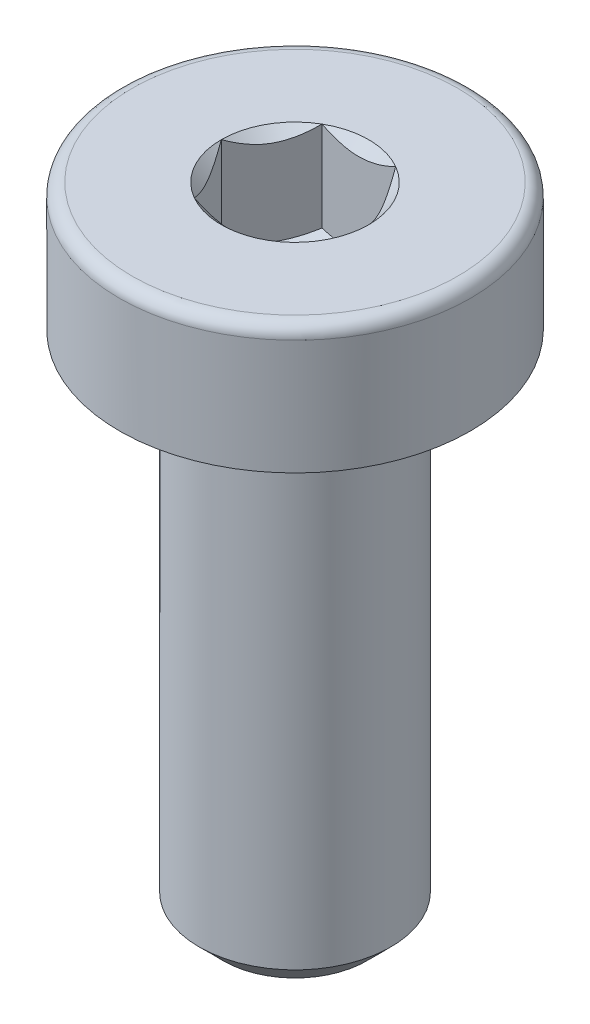
ISO-10303-21;
HEADER;
FILE_DESCRIPTION(('STEP AP214'),'2;1');
FILE_NAME('part.step','',(''),(''),'','','');
FILE_SCHEMA(('AUTOMOTIVE_DESIGN { 1 0 10303 214 1 1 1 1 }'));
ENDSEC;
DATA;
#1=APPLICATION_CONTEXT('core data for automotive mechanical design processes');
#2=APPLICATION_PROTOCOL_DEFINITION('international standard','automotive_design',2000,#1);
#3=PRODUCT_CONTEXT('',#1,'mechanical');
#4=PRODUCT('Part','Part','',(#3));
#5=PRODUCT_RELATED_PRODUCT_CATEGORY('part','',(#4));
#6=PRODUCT_DEFINITION_FORMATION('','',#4);
#7=PRODUCT_DEFINITION_CONTEXT('part definition',#1,'design');
#8=PRODUCT_DEFINITION('design','',#6,#7);
#9=PRODUCT_DEFINITION_SHAPE('','',#8);
#10=(LENGTH_UNIT() NAMED_UNIT(*) SI_UNIT(.MILLI.,.METRE.));
#11=(NAMED_UNIT(*) PLANE_ANGLE_UNIT() SI_UNIT($,.RADIAN.));
#12=(NAMED_UNIT(*) SI_UNIT($,.STERADIAN.) SOLID_ANGLE_UNIT());
#13=UNCERTAINTY_MEASURE_WITH_UNIT(LENGTH_MEASURE(1.E-05),#10,'distance_accuracy_value','');
#14=(GEOMETRIC_REPRESENTATION_CONTEXT(3) GLOBAL_UNCERTAINTY_ASSIGNED_CONTEXT((#13)) GLOBAL_UNIT_ASSIGNED_CONTEXT((#10,
#11,#12)) REPRESENTATION_CONTEXT('',''));
#15=CARTESIAN_POINT('',(0.,0.,0.));
#16=DIRECTION('',(0.,0.,1.));
#17=DIRECTION('',(1.,0.,0.));
#18=AXIS2_PLACEMENT_3D('',#15,#16,#17);
#19=CARTESIAN_POINT('',(0.,-0.2,0.));
#20=DIRECTION('',(0.,1.,0.));
#21=DIRECTION('',(0.,0.,1.));
#22=AXIS2_PLACEMENT_3D('',#19,#20,#21);
#23=TOROIDAL_SURFACE('',#22,1.7,0.2);
#24=CARTESIAN_POINT('',(0.,0.,0.));
#25=DIRECTION('',(0.,1.,0.));
#26=DIRECTION('',(0.,0.,1.));
#27=AXIS2_PLACEMENT_3D('',#24,#25,#26);
#28=CIRCLE('',#27,1.7);
#29=CARTESIAN_POINT('',(0.,0.,1.7));
#30=VERTEX_POINT('',#29);
#31=EDGE_CURVE('E128',#30,#30,#28,.T.);
#32=ORIENTED_EDGE('',*,*,#31,.F.);
#33=EDGE_LOOP('',(#32));
#34=FACE_BOUND('',#33,.T.);
#35=CARTESIAN_POINT('',(0.,-0.2,0.));
#36=DIRECTION('',(0.,-1.,0.));
#37=DIRECTION('',(0.,0.,1.));
#38=AXIS2_PLACEMENT_3D('',#35,#36,#37);
#39=CIRCLE('',#38,1.5);
#40=CARTESIAN_POINT('',(0.,-0.2,1.5));
#41=VERTEX_POINT('',#40);
#42=EDGE_CURVE('E145',#41,#41,#39,.T.);
#43=ORIENTED_EDGE('',*,*,#42,.F.);
#44=EDGE_LOOP('',(#43));
#45=FACE_BOUND('',#44,.T.);
#46=ADVANCED_FACE('F16',(#34,#45),#23,.F.);
#47=CARTESIAN_POINT('',(0.,-8.,0.));
#48=DIRECTION('',(0.,1.,0.));
#49=DIRECTION('',(1.,0.,0.));
#50=AXIS2_PLACEMENT_3D('',#47,#48,#49);
#51=PLANE('',#50);
#52=CARTESIAN_POINT('',(0.,-8.,0.));
#53=DIRECTION('',(0.,-1.,0.));
#54=DIRECTION('',(0.,0.,1.));
#55=AXIS2_PLACEMENT_3D('',#52,#53,#54);
#56=CIRCLE('',#55,1.125);
#57=CARTESIAN_POINT('',(0.,-8.,1.125));
#58=VERTEX_POINT('',#57);
#59=EDGE_CURVE('E11',#58,#58,#56,.T.);
#60=ORIENTED_EDGE('',*,*,#59,.T.);
#61=EDGE_LOOP('',(#60));
#62=FACE_BOUND('',#61,.T.);
#63=ADVANCED_FACE('F213',(#62),#51,.F.);
#64=CARTESIAN_POINT('',(0.,-8.125,0.));
#65=DIRECTION('',(0.,1.,0.));
#66=DIRECTION('',(-1.,0.,0.));
#67=AXIS2_PLACEMENT_3D('',#64,#65,#66);
#68=CONICAL_SURFACE('',#67,1.,0.785398163397448);
#69=ORIENTED_EDGE('',*,*,#59,.F.);
#70=EDGE_LOOP('',(#69));
#71=FACE_BOUND('',#70,.T.);
#72=CARTESIAN_POINT('',(0.,-7.625,0.));
#73=DIRECTION('',(0.,-1.,0.));
#74=DIRECTION('',(-1.,0.,0.));
#75=AXIS2_PLACEMENT_3D('',#72,#73,#74);
#76=CIRCLE('',#75,1.5);
#77=CARTESIAN_POINT('',(-1.5,-7.625,0.));
#78=VERTEX_POINT('',#77);
#79=EDGE_CURVE('E149',#78,#78,#76,.T.);
#80=ORIENTED_EDGE('',*,*,#79,.T.);
#81=EDGE_LOOP('',(#80));
#82=FACE_BOUND('',#81,.T.);
#83=ADVANCED_FACE('F170',(#71,#82),#68,.T.);
#84=CARTESIAN_POINT('',(-1.15470053837925,0.5,0.));
#85=DIRECTION('',(-0.866025403784439,0.,0.5));
#86=DIRECTION('',(0.,1.,0.));
#87=AXIS2_PLACEMENT_3D('',#84,#85,#86);
#88=PLANE('',#87);
#89=CARTESIAN_POINT('',(-1.15470053837925,2.,0.));
#90=CARTESIAN_POINT('',(-1.00117078125086,1.84647024287162,0.265921339820074));
#91=CARTESIAN_POINT('',(-0.867089249093141,1.84530172515184,0.498157365873931));
#92=CARTESIAN_POINT('',(-0.733215253083504,1.8441350161052,0.730033928774895));
#93=CARTESIAN_POINT('',(-0.57735026918948,1.99999999999927,1.00000000000025));
#94=B_SPLINE_CURVE_WITH_KNOTS('',2,(#89,#90,#91,#92,#93),.UNSPECIFIED.,.F.,.F.,(3,2,3),(0.,0.5,
1.),.UNSPECIFIED.);
#95=CARTESIAN_POINT('',(-1.15470053837925,2.,0.));
#96=VERTEX_POINT('',#95);
#97=CARTESIAN_POINT('',(-0.577350269189626,2.,1.));
#98=VERTEX_POINT('',#97);
#99=EDGE_CURVE('E135',#96,#98,#94,.T.);
#100=ORIENTED_EDGE('',*,*,#99,.T.);
#101=DIRECTION('',(0.,1.,0.));
#102=VECTOR('',#101,1.);
#103=CARTESIAN_POINT('',(-0.577350269189626,0.5,1.));
#104=LINE('',#103,#102);
#105=CARTESIAN_POINT('',(-0.577350269189626,0.589316397477042,1.));
#106=VERTEX_POINT('',#105);
#107=EDGE_CURVE('E334',#106,#98,#104,.T.);
#108=ORIENTED_EDGE('',*,*,#107,.F.);
#109=CARTESIAN_POINT('',(-1.15470053837925,0.589316397477043,0.));
#110=CARTESIAN_POINT('',(-1.1422776254852,0.582145061548454,0.021515887063845));
#111=CARTESIAN_POINT('',(-1.12980572440145,0.575290529962869,0.0431130815008311));
#112=CARTESIAN_POINT('',(-1.10516877386456,0.562518070323557,0.0858404042081745));
#113=CARTESIAN_POINT('',(-1.09300571707735,0.556578244850613,0.106965156736799));
#114=CARTESIAN_POINT('',(-1.06894241920652,0.545632531934319,0.148883907199831));
#115=CARTESIAN_POINT('',(-1.05704304561731,0.540607317583832,0.169673316642415));
#116=CARTESIAN_POINT('',(-1.03344126715609,0.531488117613305,0.211063578718422));
#117=CARTESIAN_POINT('',(-1.02173909837023,0.527379242171332,0.231661269176965));
#118=CARTESIAN_POINT('',(-0.998439619296902,0.520087570224119,0.272815704232481));
#119=CARTESIAN_POINT('',(-0.986842367431211,0.516896357949622,0.293370983478975));
#120=CARTESIAN_POINT('',(-0.963630649649038,0.511432897740972,0.33458880079611));
#121=CARTESIAN_POINT('',(-0.952016187375457,0.509160477291832,0.355251317992815));
#122=CARTESIAN_POINT('',(-0.928615137972573,0.505525933544308,0.396828053797181));
#123=CARTESIAN_POINT('',(-0.916827980653532,0.504172969622274,0.41774275139525));
#124=CARTESIAN_POINT('',(-0.892891053471395,0.502367479696766,0.459958305071784));
#125=CARTESIAN_POINT('',(-0.88073874884194,0.501933526563364,0.481258507610898));
#126=CARTESIAN_POINT('',(-0.856257235695783,0.501957698326459,0.523654214585648));
#127=CARTESIAN_POINT('',(-0.843928822248721,0.502412614939665,0.544750180023796));
#128=CARTESIAN_POINT('',(-0.819420681665752,0.504253995001974,0.586439287846091));
#129=CARTESIAN_POINT('',(-0.80724270276635,0.505622235893781,0.607034252182705));
#130=CARTESIAN_POINT('',(-0.783017066755103,0.509280885955065,0.647952632793485));
#131=CARTESIAN_POINT('',(-0.770969274303699,0.511562376898162,0.668276765739735));
#132=CARTESIAN_POINT('',(-0.746956492541301,0.51703779791969,0.708859066345339));
#133=CARTESIAN_POINT('',(-0.734991529583474,0.520232005852064,0.729117212014218));
#134=CARTESIAN_POINT('',(-0.711075209617807,0.527523596594688,0.769746807127452));
#135=CARTESIAN_POINT('',(-0.699125090769733,0.531629372272877,0.790117471798635));
#136=CARTESIAN_POINT('',(-0.675154824355723,0.540736433878131,0.831125976310756));
#137=CARTESIAN_POINT('',(-0.663137276162293,0.545752483880906,0.851762040669467));
#138=CARTESIAN_POINT('',(-0.638941132936142,0.556674024791821,0.893430606128303));
#139=CARTESIAN_POINT('',(-0.626766044340648,0.562598648059455,0.914460089337463));
#140=CARTESIAN_POINT('',(-0.602159683115032,0.575334898103387,0.957023431622116));
#141=CARTESIAN_POINT('',(-0.58973203881774,0.582168191432241,0.978552925679333));
#142=CARTESIAN_POINT('',(-0.57735026918962,0.589316397477036,0.999999999999998));
#143=B_SPLINE_CURVE_WITH_KNOTS('',3,(#109,#110,#111,#112,#113,#114,#115,#116,#117,#118,#119,
#120,#121,#122,#123,#124,#125,#126,#127,#128,#129,#130,#131,#132,#133,#134,#135,#136,#137,#138,
#139,#140,#141,#142),.UNSPECIFIED.,.F.,.F.,(4,2,2,2,2,2,2,2,2,2,2,2,2,2,2,2,4),(0.,
0.0775799336285172,0.15283713344211,0.226249266739255,0.298363815314992,0.369794224205565,
0.441211214882481,0.51332960442225,0.586892093802747,0.66018955743096,0.732066645944519,
0.803258313913417,0.8744716775434,0.946370107950428,1.01956032219192,1.09458388807375,
1.17191346643988),.UNSPECIFIED.);
#144=CARTESIAN_POINT('',(-1.15470053837925,0.589316397477044,0.));
#145=VERTEX_POINT('',#144);
#146=EDGE_CURVE('E250',#145,#106,#143,.T.);
#147=ORIENTED_EDGE('',*,*,#146,.F.);
#148=DIRECTION('',(0.,1.,0.));
#149=VECTOR('',#148,1.);
#150=CARTESIAN_POINT('',(-1.15470053837925,0.5,0.));
#151=LINE('',#150,#149);
#152=EDGE_CURVE('E29',#145,#96,#151,.T.);
#153=ORIENTED_EDGE('',*,*,#152,.T.);
#154=EDGE_LOOP('',(#100,#108,#147,#153));
#155=FACE_BOUND('',#154,.T.);
#156=ADVANCED_FACE('F160',(#155),#88,.F.);
#157=CARTESIAN_POINT('',(-0.577350269189624,0.5,-1.));
#158=DIRECTION('',(-0.866025403784438,0.,-0.5));
#159=DIRECTION('',(-0.5,0.,0.866025403784438));
#160=AXIS2_PLACEMENT_3D('',#157,#158,#159);
#161=PLANE('',#160);
#162=CARTESIAN_POINT('',(-0.577350269189625,2.,-0.999999999999998));
#163=CARTESIAN_POINT('',(-0.730880026318,1.84647024287162,-0.734078660179944));
#164=CARTESIAN_POINT('',(-0.864961558475733,1.84530172515184,-0.501842634126069));
#165=CARTESIAN_POINT('',(-0.998835554485382,1.8441350161052,-0.269966071225084));
#166=CARTESIAN_POINT('',(-1.15470053837939,1.99999999999928,2.43945488809238E-13));
#167=B_SPLINE_CURVE_WITH_KNOTS('',2,(#162,#163,#164,#165,#166),.UNSPECIFIED.,.F.,.F.,(3,2,3),
(0.,0.5,1.),.UNSPECIFIED.);
#168=CARTESIAN_POINT('',(-0.577350269189625,2.,-1.));
#169=VERTEX_POINT('',#168);
#170=EDGE_CURVE('E402',#169,#96,#167,.T.);
#171=ORIENTED_EDGE('',*,*,#170,.T.);
#172=ORIENTED_EDGE('',*,*,#152,.F.);
#173=CARTESIAN_POINT('',(-0.577350269189627,0.589316397477045,-1.));
#174=CARTESIAN_POINT('',(-0.589772117524805,0.582145061548479,-0.978483498312897));
#175=CARTESIAN_POINT('',(-0.602239886015797,0.575290529962917,-0.956883917922458));
#176=CARTESIAN_POINT('',(-0.626924357647565,0.562518070323645,-0.914184031532187));
#177=CARTESIAN_POINT('',(-0.639137401592391,0.556578244850719,-0.893088139102523));
#178=CARTESIAN_POINT('',(-0.663408455452852,0.54563253193445,-0.851289336616123));
#179=CARTESIAN_POINT('',(-0.675462925365203,0.540607317583974,-0.830589472077488));
#180=CARTESIAN_POINT('',(-0.699507054561722,0.53148811761346,-0.789454601317619));
#181=CARTESIAN_POINT('',(-0.711494093365185,0.527379242171491,-0.769021380640425));
#182=CARTESIAN_POINT('',(-0.735485140065021,0.520087570224278,-0.728266222340228));
#183=CARTESIAN_POINT('',(-0.747487908141538,0.516896357949778,-0.707945067987197));
#184=CARTESIAN_POINT('',(-0.771577726135665,0.511432897741115,-0.667234222063753));
#185=CARTESIAN_POINT('',(-0.783664759797369,0.509160477291966,-0.646844544085154));
#186=CARTESIAN_POINT('',(-0.807970744508966,0.505525933544416,-0.605790272924778));
#187=CARTESIAN_POINT('',(-0.820189825281854,0.504172969622366,-0.585124946448999));
#188=CARTESIAN_POINT('',(-0.844781103609498,0.502367479696817,-0.54328718258234));
#189=CARTESIAN_POINT('',(-0.857151467799394,0.501933526563389,-0.522112876789074));
#190=CARTESIAN_POINT('',(-0.881626470477781,0.501957698326439,-0.479713410994005));
#191=CARTESIAN_POINT('',(-0.89373190574098,0.50241261493962,-0.458488709041452));
#192=CARTESIAN_POINT('',(-0.917581661884609,0.504253995001887,-0.416419482786004));
#193=CARTESIAN_POINT('',(-0.929328434740412,0.505622235893679,-0.395575561524098));
#194=CARTESIAN_POINT('',(-0.952651973825387,0.509280885954937,-0.354136355010195));
#195=CARTESIAN_POINT('',(-0.964229293041011,0.511562376898024,-0.333540594214658));
#196=CARTESIAN_POINT('',(-0.987368205428263,0.517037797919539,-0.292453764890132));
#197=CARTESIAN_POINT('',(-0.998929792732163,0.52023200585191,-0.271962730178892));
#198=CARTESIAN_POINT('',(-1.02215789426288,0.527523596594534,-0.230935791966992));
#199=CARTESIAN_POINT('',(-1.03382434793608,0.531629372272727,-0.210401353130728));
#200=CARTESIAN_POINT('',(-1.05735362140782,0.540736433877994,-0.169138241224641));
#201=CARTESIAN_POINT('',(-1.06921620327991,0.54575248388078,-0.148412707018555));
#202=CARTESIAN_POINT('',(-1.09320416789351,0.55667402479172,-0.106623949581629));
#203=CARTESIAN_POINT('',(-1.10532869028339,0.562598648059372,-0.0855652719599876));
#204=CARTESIAN_POINT('',(-1.12988644535915,0.575334898103344,-0.0429738669014798));
#205=CARTESIAN_POINT('',(-1.14231771199472,0.58216819143222,-0.0214464642021553));
#206=CARTESIAN_POINT('',(-1.15470053837925,0.589316397477038,0.));
#207=B_SPLINE_CURVE_WITH_KNOTS('',3,(#173,#174,#175,#176,#177,#178,#179,#180,#181,#182,#183,
#184,#185,#186,#187,#188,#189,#190,#191,#192,#193,#194,#195,#196,#197,#198,#199,#200,#201,#202,
#203,#204,#205,#206),.UNSPECIFIED.,.F.,.F.,(4,2,2,2,2,2,2,2,2,2,2,2,2,2,2,2,4),(0.,
0.0775799336282744,0.152837133441706,0.226249266738765,0.298363815314486,0.369794224205106,
0.441211214882123,0.513329604422042,0.586892093802727,0.660189557430751,0.73206664594416,
0.803258313912957,0.874471677542892,0.946370107949937,1.01956032219152,1.09458388807351,
1.17191346643989),.UNSPECIFIED.);
#208=CARTESIAN_POINT('',(-0.577350269189625,0.589316397477047,-1.));
#209=VERTEX_POINT('',#208);
#210=EDGE_CURVE('E194',#209,#145,#207,.T.);
#211=ORIENTED_EDGE('',*,*,#210,.F.);
#212=DIRECTION('',(0.,1.,0.));
#213=VECTOR('',#212,1.);
#214=CARTESIAN_POINT('',(-0.577350269189625,0.5,-1.));
#215=LINE('',#214,#213);
#216=EDGE_CURVE('E410',#209,#169,#215,.T.);
#217=ORIENTED_EDGE('',*,*,#216,.T.);
#218=EDGE_LOOP('',(#171,#172,#211,#217));
#219=FACE_BOUND('',#218,.T.);
#220=ADVANCED_FACE('F169',(#219),#161,.F.);
#221=CARTESIAN_POINT('',(0.577350269189628,0.5,-1.));
#222=DIRECTION('',(0.,0.,-1.));
#223=DIRECTION('',(0.,-1.,0.));
#224=AXIS2_PLACEMENT_3D('',#221,#222,#223);
#225=PLANE('',#224);
#226=CARTESIAN_POINT('',(0.577350269189625,2.,-1.));
#227=CARTESIAN_POINT('',(0.270060534721078,1.84635513276574,-1.));
#228=CARTESIAN_POINT('',(0.000495609398556127,1.84529958443508,-1.));
#229=CARTESIAN_POINT('',(-0.265863448139593,1.84425658947496,-1.));
#230=CARTESIAN_POINT('',(-0.577350269189632,2.,-1.));
#231=B_SPLINE_CURVE_WITH_KNOTS('',2,(#226,#227,#228,#229,#230),.UNSPECIFIED.,.F.,.F.,(3,2,3),
(0.,0.5,1.),.UNSPECIFIED.);
#232=CARTESIAN_POINT('',(0.577350269189628,2.,-1.));
#233=VERTEX_POINT('',#232);
#234=EDGE_CURVE('E384',#233,#169,#231,.T.);
#235=ORIENTED_EDGE('',*,*,#234,.T.);
#236=ORIENTED_EDGE('',*,*,#216,.F.);
#237=CARTESIAN_POINT('',(0.577350269189629,0.589316397477046,-1.));
#238=CARTESIAN_POINT('',(0.552505507960357,0.582145061548458,-0.999999385376672));
#239=CARTESIAN_POINT('',(0.527565838385578,0.575290529962872,-0.999996999423149));
#240=CARTESIAN_POINT('',(0.47824441621688,0.56251807032356,-1.0000244357401));
#241=CARTESIAN_POINT('',(0.453868315484823,0.556578244850616,-1.00005329583901));
#242=CARTESIAN_POINT('',(0.405533963753522,0.545632531934322,-1.00017324381556));
#243=CARTESIAN_POINT('',(0.381580120251964,0.540607317583835,-1.00026278871947));
#244=CARTESIAN_POINT('',(0.333934212594235,0.531488117613308,-1.00051818003557));
#245=CARTESIAN_POINT('',(0.310245005004916,0.527379242171335,-1.00068264981691));
#246=CARTESIAN_POINT('',(0.262954479231781,0.520087570224122,-1.00108192657222));
#247=CARTESIAN_POINT('',(0.239354459289589,0.516896357949625,-1.00131605146569));
#248=CARTESIAN_POINT('',(0.192052923513318,0.511432897740975,-1.00182302285942));
#249=CARTESIAN_POINT('',(0.168351427578049,0.509160477291835,-1.00209586207756));
#250=CARTESIAN_POINT('',(0.120644393463594,0.505525933544311,-1.00261832672163));
#251=CARTESIAN_POINT('',(0.0966381553716762,0.504172969622278,-1.00286769784397));
#252=CARTESIAN_POINT('',(0.0481099498619062,0.50236747969677,-1.00324548765397));
#253=CARTESIAN_POINT('',(0.023587281042553,0.501933526563368,-1.00337138439989));
#254=CARTESIAN_POINT('',(-0.0253692347820597,0.501957698326463,-1.00336762557961));
#255=CARTESIAN_POINT('',(-0.0498030834923871,0.502412614939669,-1.00323888906517));
#256=CARTESIAN_POINT('',(-0.0981609802190884,0.504253995001978,-1.00285877063195));
#257=CARTESIAN_POINT('',(-0.122085731974333,0.505622235893786,-1.00260981370662));
#258=CARTESIAN_POINT('',(-0.169634907070614,0.509280885955069,-1.00208898780344));
#259=CARTESIAN_POINT('',(-0.193260018737662,0.511562376898166,-1.00181735995412));
#260=CARTESIAN_POINT('',(-0.240411712887332,0.517037797919695,-1.00131283123516));
#261=CARTESIAN_POINT('',(-0.26393826314906,0.520232005852068,-1.00107994219278));
#262=CARTESIAN_POINT('',(-0.31108268464543,0.527523596594693,-1.00068259909409));
#263=CARTESIAN_POINT('',(-0.334699257166686,0.531629372272882,-1.00051882492901));
#264=CARTESIAN_POINT('',(-0.382198797052396,0.540736433878136,-1.00026421753506));
#265=CARTESIAN_POINT('',(-0.406078927117886,0.545752483880911,-1.0001747476877));
#266=CARTESIAN_POINT('',(-0.454263034957568,0.556674024791826,-1.00005455570966));
#267=CARTESIAN_POINT('',(-0.478562645942905,0.56259864805946,-1.00002536129722));
#268=CARTESIAN_POINT('',(-0.527726762244194,0.575334898103392,-0.999997298523466));
#269=CARTESIAN_POINT('',(-0.552585673177015,0.582168191432246,-0.999999389881423));
#270=CARTESIAN_POINT('',(-0.577350269189624,0.589316397477041,-0.999999999999998));
#271=B_SPLINE_CURVE_WITH_KNOTS('',3,(#237,#238,#239,#240,#241,#242,#243,#244,#245,#246,#247,
#248,#249,#250,#251,#252,#253,#254,#255,#256,#257,#258,#259,#260,#261,#262,#263,#264,#265,#266,
#267,#268,#269,#270),.UNSPECIFIED.,.F.,.F.,(4,2,2,2,2,2,2,2,2,2,2,2,2,2,2,2,4),(0.,
0.0775799336285192,0.152837133442114,0.22624926673926,0.298363815314997,0.369794224205569,
0.441211214882483,0.513329604422249,0.586892093802744,0.660189557430959,0.732066645944521,
0.803258313913422,0.874471677543404,0.946370107950433,1.01956032219193,1.09458388807376,
1.17191346643988),.UNSPECIFIED.);
#272=CARTESIAN_POINT('',(0.577350269189628,0.589316397477047,-1.));
#273=VERTEX_POINT('',#272);
#274=EDGE_CURVE('E392',#273,#209,#271,.T.);
#275=ORIENTED_EDGE('',*,*,#274,.F.);
#276=DIRECTION('',(0.,1.,0.));
#277=VECTOR('',#276,1.);
#278=CARTESIAN_POINT('',(0.577350269189628,0.5,-1.));
#279=LINE('',#278,#277);
#280=EDGE_CURVE('E333',#273,#233,#279,.T.);
#281=ORIENTED_EDGE('',*,*,#280,.T.);
#282=EDGE_LOOP('',(#235,#236,#275,#281));
#283=FACE_BOUND('',#282,.T.);
#284=ADVANCED_FACE('F268',(#283),#225,.F.);
#285=CARTESIAN_POINT('',(1.15470053837925,0.5,0.));
#286=DIRECTION('',(0.866025403784439,0.,-0.5));
#287=DIRECTION('',(0.,-1.,0.));
#288=AXIS2_PLACEMENT_3D('',#285,#286,#287);
#289=PLANE('',#288);
#290=CARTESIAN_POINT('',(1.15470053837925,2.,0.));
#291=CARTESIAN_POINT('',(1.00117078125086,1.84647024287162,-0.265921339820078));
#292=CARTESIAN_POINT('',(0.867089249093142,1.84530172515184,-0.498157365873931));
#293=CARTESIAN_POINT('',(0.733215253083495,1.84413501610522,-0.730033928774914));
#294=CARTESIAN_POINT('',(0.577350269189482,1.99999999999929,-1.00000000000025));
#295=B_SPLINE_CURVE_WITH_KNOTS('',2,(#290,#291,#292,#293,#294),.UNSPECIFIED.,.F.,.F.,(3,2,3),
(0.,0.5,1.),.UNSPECIFIED.);
#296=CARTESIAN_POINT('',(1.15470053837925,2.,0.));
#297=VERTEX_POINT('',#296);
#298=EDGE_CURVE('E341',#297,#233,#295,.T.);
#299=ORIENTED_EDGE('',*,*,#298,.T.);
#300=ORIENTED_EDGE('',*,*,#280,.F.);
#301=CARTESIAN_POINT('',(1.15470053837925,0.589316397477043,0.));
#302=CARTESIAN_POINT('',(1.1422776254852,0.582145061548455,-0.0215158870638419));
#303=CARTESIAN_POINT('',(1.12980572440145,0.575290529962869,-0.0431130815008281));
#304=CARTESIAN_POINT('',(1.10516877386457,0.562518070323558,-0.0858404042081722));
#305=CARTESIAN_POINT('',(1.09300571707735,0.556578244850615,-0.106965156736797));
#306=CARTESIAN_POINT('',(1.06894241920652,0.545632531934321,-0.148883907199829));
#307=CARTESIAN_POINT('',(1.05704304561732,0.540607317583834,-0.169673316642413));
#308=CARTESIAN_POINT('',(1.03344126715609,0.531488117613307,-0.211063578718421));
#309=CARTESIAN_POINT('',(1.02173909837023,0.527379242171335,-0.231661269176964));
#310=CARTESIAN_POINT('',(0.998439619296906,0.520087570224122,-0.272815704232479));
#311=CARTESIAN_POINT('',(0.986842367431215,0.516896357949625,-0.293370983478973));
#312=CARTESIAN_POINT('',(0.963630649649042,0.511432897740975,-0.334588800796107));
#313=CARTESIAN_POINT('',(0.952016187375462,0.509160477291835,-0.355251317992812));
#314=CARTESIAN_POINT('',(0.928615137972578,0.505525933544311,-0.396828053797177));
#315=CARTESIAN_POINT('',(0.916827980653537,0.504172969622278,-0.417742751395246));
#316=CARTESIAN_POINT('',(0.892891053471401,0.50236747969677,-0.459958305071779));
#317=CARTESIAN_POINT('',(0.880738748841946,0.501933526563367,-0.481258507610893));
#318=CARTESIAN_POINT('',(0.856257235695789,0.501957698326462,-0.523654214585642));
#319=CARTESIAN_POINT('',(0.843928822248727,0.502412614939669,-0.54475018002379));
#320=CARTESIAN_POINT('',(0.819420681665758,0.504253995001977,-0.586439287846085));
#321=CARTESIAN_POINT('',(0.807242702766356,0.505622235893785,-0.6070342521827));
#322=CARTESIAN_POINT('',(0.783017066755108,0.509280885955068,-0.64795263279348));
#323=CARTESIAN_POINT('',(0.770969274303704,0.511562376898166,-0.66827676573973));
#324=CARTESIAN_POINT('',(0.746956492541306,0.517037797919694,-0.708859066345335));
#325=CARTESIAN_POINT('',(0.734991529583479,0.520232005852067,-0.729117212014214));
#326=CARTESIAN_POINT('',(0.711075209617813,0.527523596594692,-0.769746807127448));
#327=CARTESIAN_POINT('',(0.699125090769738,0.531629372272881,-0.790117471798631));
#328=CARTESIAN_POINT('',(0.675154824355728,0.540736433878135,-0.831125976310752));
#329=CARTESIAN_POINT('',(0.663137276162299,0.545752483880911,-0.851762040669464));
#330=CARTESIAN_POINT('',(0.638941132936147,0.556674024791825,-0.8934306061283));
#331=CARTESIAN_POINT('',(0.626766044340653,0.562598648059459,-0.91446008933746));
#332=CARTESIAN_POINT('',(0.602159683115038,0.575334898103392,-0.957023431622114));
#333=CARTESIAN_POINT('',(0.589732038817745,0.582168191432245,-0.978552925679331));
#334=CARTESIAN_POINT('',(0.577350269189625,0.589316397477041,-0.999999999999997));
#335=B_SPLINE_CURVE_WITH_KNOTS('',3,(#301,#302,#303,#304,#305,#306,#307,#308,#309,#310,#311,
#312,#313,#314,#315,#316,#317,#318,#319,#320,#321,#322,#323,#324,#325,#326,#327,#328,#329,#330,
#331,#332,#333,#334),.UNSPECIFIED.,.F.,.F.,(4,2,2,2,2,2,2,2,2,2,2,2,2,2,2,2,4),(0.,
0.0775799336285166,0.15283713344211,0.226249266739254,0.298363815314991,0.369794224205563,
0.441211214882478,0.513329604422245,0.586892093802741,0.660189557430954,0.732066645944514,
0.803258313913414,0.874471677543396,0.946370107950424,1.01956032219192,1.09458388807375,
1.17191346643988),.UNSPECIFIED.);
#336=CARTESIAN_POINT('',(1.15470053837925,0.589316397477045,0.));
#337=VERTEX_POINT('',#336);
#338=EDGE_CURVE('E379',#337,#273,#335,.T.);
#339=ORIENTED_EDGE('',*,*,#338,.F.);
#340=DIRECTION('',(0.,1.,0.));
#341=VECTOR('',#340,1.);
#342=CARTESIAN_POINT('',(1.15470053837925,0.5,0.));
#343=LINE('',#342,#341);
#344=EDGE_CURVE('E99',#337,#297,#343,.T.);
#345=ORIENTED_EDGE('',*,*,#344,.T.);
#346=EDGE_LOOP('',(#299,#300,#339,#345));
#347=FACE_BOUND('',#346,.T.);
#348=ADVANCED_FACE('F501',(#347),#289,.F.);
#349=CARTESIAN_POINT('',(0.577350269189626,0.5,1.));
#350=DIRECTION('',(0.866025403784439,0.,0.5));
#351=DIRECTION('',(0.,-1.,0.));
#352=AXIS2_PLACEMENT_3D('',#349,#350,#351);
#353=PLANE('',#352);
#354=CARTESIAN_POINT('',(0.577350269189625,2.,1.));
#355=CARTESIAN_POINT('',(0.730880026318006,1.84647024287162,0.734078660179936));
#356=CARTESIAN_POINT('',(0.864961558475735,1.84530172515183,0.501842634126069));
#357=CARTESIAN_POINT('',(0.998835554485375,1.8441350161052,0.269966071225099));
#358=CARTESIAN_POINT('',(1.1547005383794,1.99999999999928,-2.51968584885631E-13));
#359=B_SPLINE_CURVE_WITH_KNOTS('',2,(#354,#355,#356,#357,#358),.UNSPECIFIED.,.F.,.F.,(3,2,3),
(0.,0.5,1.),.UNSPECIFIED.);
#360=CARTESIAN_POINT('',(0.577350269189626,2.,1.));
#361=VERTEX_POINT('',#360);
#362=EDGE_CURVE('E342',#361,#297,#359,.T.);
#363=ORIENTED_EDGE('',*,*,#362,.T.);
#364=ORIENTED_EDGE('',*,*,#344,.F.);
#365=CARTESIAN_POINT('',(0.577350269189629,0.589316397477041,1.));
#366=CARTESIAN_POINT('',(0.589772117524845,0.582145061548453,0.97848349831283));
#367=CARTESIAN_POINT('',(0.602239886015871,0.575290529962867,0.95688391792232));
#368=CARTESIAN_POINT('',(0.626924357647685,0.562518070323555,0.914184031531926));
#369=CARTESIAN_POINT('',(0.639137401592525,0.556578244850612,0.893088139102211));
#370=CARTESIAN_POINT('',(0.663408455452999,0.545632531934318,0.851289336615727));
#371=CARTESIAN_POINT('',(0.675462925365349,0.540607317583831,0.83058947207706));
#372=CARTESIAN_POINT('',(0.699507054561857,0.531488117613304,0.789454601317146));
#373=CARTESIAN_POINT('',(0.71149409336531,0.527379242171332,0.769021380639941));
#374=CARTESIAN_POINT('',(0.735485140065122,0.520087570224119,0.728266222339741));
#375=CARTESIAN_POINT('',(0.747487908141624,0.516896357949621,0.70794506798672));
#376=CARTESIAN_POINT('',(0.771577726135722,0.511432897740971,0.667234222063315));
#377=CARTESIAN_POINT('',(0.783664759797411,0.509160477291832,0.646844544084746));
#378=CARTESIAN_POINT('',(0.807970744508983,0.505525933544308,0.605790272924451));
#379=CARTESIAN_POINT('',(0.82018982528186,0.504172969622274,0.585124946448723));
#380=CARTESIAN_POINT('',(0.844781103609495,0.502367479696766,0.543287182582189));
#381=CARTESIAN_POINT('',(0.857151467799393,0.501933526563364,0.522112876788997));
#382=CARTESIAN_POINT('',(0.881626470477849,0.501957698326459,0.479713410993967));
#383=CARTESIAN_POINT('',(0.893731905741113,0.502412614939665,0.458488709041379));
#384=CARTESIAN_POINT('',(0.917581661884845,0.504253995001974,0.41641948278586));
#385=CARTESIAN_POINT('',(0.929328434740686,0.505622235893782,0.395575561523919));
#386=CARTESIAN_POINT('',(0.952651973825719,0.509280885955065,0.354136355009953));
#387=CARTESIAN_POINT('',(0.964229293041362,0.511562376898163,0.333540594214389));
#388=CARTESIAN_POINT('',(0.987368205428633,0.517037797919691,0.292453764889818));
#389=CARTESIAN_POINT('',(0.998929792732534,0.520232005852065,0.27196273017856));
#390=CARTESIAN_POINT('',(1.02215789426324,0.527523596594689,0.230935791966639));
#391=CARTESIAN_POINT('',(1.03382434793642,0.531629372272878,0.210401353130372));
#392=CARTESIAN_POINT('',(1.05735362140812,0.540736433878132,0.169138241224298));
#393=CARTESIAN_POINT('',(1.06921620328018,0.545752483880908,0.148412707018228));
#394=CARTESIAN_POINT('',(1.09320416789371,0.556674024791822,0.106623949581356));
#395=CARTESIAN_POINT('',(1.10532869028355,0.562598648059457,0.0855652719597518));
#396=CARTESIAN_POINT('',(1.12988644535923,0.575334898103389,0.0429738669013457));
#397=CARTESIAN_POINT('',(1.14231771199476,0.582168191432243,0.0214464642020851));
#398=CARTESIAN_POINT('',(1.15470053837925,0.589316397477038,0.));
#399=B_SPLINE_CURVE_WITH_KNOTS('',3,(#365,#366,#367,#368,#369,#370,#371,#372,#373,#374,#375,
#376,#377,#378,#379,#380,#381,#382,#383,#384,#385,#386,#387,#388,#389,#390,#391,#392,#393,#394,
#395,#396,#397,#398),.UNSPECIFIED.,.F.,.F.,(4,2,2,2,2,2,2,2,2,2,2,2,2,2,2,2,4),(0.,
0.077579933628518,0.152837133442112,0.226249266739257,0.298363815314994,0.369794224205567,
0.441211214882482,0.51332960442225,0.586892093802747,0.66018955743096,0.73206664594452,
0.803258313913421,0.874471677543402,0.946370107950432,1.01956032219193,1.09458388807376,
1.17191346643989),.UNSPECIFIED.);
#400=CARTESIAN_POINT('',(0.577350269189626,0.589316397477042,1.));
#401=VERTEX_POINT('',#400);
#402=EDGE_CURVE('E375',#401,#337,#399,.T.);
#403=ORIENTED_EDGE('',*,*,#402,.F.);
#404=DIRECTION('',(0.,1.,0.));
#405=VECTOR('',#404,1.);
#406=CARTESIAN_POINT('',(0.577350269189626,0.5,1.));
#407=LINE('',#406,#405);
#408=EDGE_CURVE('E88',#401,#361,#407,.T.);
#409=ORIENTED_EDGE('',*,*,#408,.T.);
#410=EDGE_LOOP('',(#363,#364,#403,#409));
#411=FACE_BOUND('',#410,.T.);
#412=ADVANCED_FACE('F265',(#411),#353,.F.);
#413=CARTESIAN_POINT('',(-0.577350269189626,0.5,1.));
#414=DIRECTION('',(0.,0.,1.));
#415=DIRECTION('',(1.,0.,0.));
#416=AXIS2_PLACEMENT_3D('',#413,#414,#415);
#417=PLANE('',#416);
#418=CARTESIAN_POINT('',(-0.577350269189628,2.,1.));
#419=CARTESIAN_POINT('',(-0.270060534721116,1.84635513276573,1.));
#420=CARTESIAN_POINT('',(-0.000495609398554068,1.84529958443507,1.));
#421=CARTESIAN_POINT('',(0.265863448139567,1.84425658947493,1.));
#422=CARTESIAN_POINT('',(0.57735026918964,1.99999999999998,1.));
#423=B_SPLINE_CURVE_WITH_KNOTS('',2,(#418,#419,#420,#421,#422),.UNSPECIFIED.,.F.,.F.,(3,2,3),
(0.,0.5,1.),.UNSPECIFIED.);
#424=EDGE_CURVE('E286',#98,#361,#423,.T.);
#425=ORIENTED_EDGE('',*,*,#424,.T.);
#426=ORIENTED_EDGE('',*,*,#408,.F.);
#427=CARTESIAN_POINT('',(-0.577350269189634,0.589316397477041,1.));
#428=CARTESIAN_POINT('',(-0.552509188921581,0.582146146644213,0.999999410681156));
#429=CARTESIAN_POINT('',(-0.527573353009553,0.575292164970257,0.999996135236956));
#430=CARTESIAN_POINT('',(-0.478262590823696,0.562520705055407,1.00002065921441));
#431=CARTESIAN_POINT('',(-0.45389333238665,0.556581270665785,1.00004752759492));
#432=CARTESIAN_POINT('',(-0.405575701958643,0.5456362325618,1.00016301057745));
#433=CARTESIAN_POINT('',(-0.381631756886763,0.540611223406213,1.00025008725702));
#434=CARTESIAN_POINT('',(-0.334008732251698,0.531492358652863,1.00050074817186));
#435=CARTESIAN_POINT('',(-0.310332529781074,0.527383513863851,1.00066294226553));
#436=CARTESIAN_POINT('',(-0.263071166817641,0.520091829669054,1.00105851823854));
#437=CARTESIAN_POINT('',(-0.239487323334236,0.516900458315821,1.00129119992797));
#438=CARTESIAN_POINT('',(-0.19222135952883,0.511436682987336,1.00179693290733));
#439=CARTESIAN_POINT('',(-0.168539273688525,0.509163980275795,1.0020699710345));
#440=CARTESIAN_POINT('',(-0.120968666616696,0.505535844377386,1.0025937905998));
#441=CARTESIAN_POINT('',(-0.097079738975184,0.504185725886581,1.00284443596971));
#442=CARTESIAN_POINT('',(-0.0487943254453937,0.50237955978456,1.00323031944072));
#443=CARTESIAN_POINT('',(-0.0243971484261165,0.501941729168259,1.00336317618692));
#444=CARTESIAN_POINT('',(0.0245592809649892,0.501949118408598,1.00337596948335));
#445=CARTESIAN_POINT('',(0.0491185329555203,0.502400225959888,1.00325421937165));
#446=CARTESIAN_POINT('',(0.0977190298961206,0.504241049569115,1.00288221391613));
#447=CARTESIAN_POINT('',(0.121760989080045,0.505612186958667,1.00263452525113));
#448=CARTESIAN_POINT('',(0.169446515997906,0.509277290512429,1.00211501192311));
#449=CARTESIAN_POINT('',(0.193091067612033,0.511558499995219,1.00184355979864));
#450=CARTESIAN_POINT('',(0.240278393979013,0.517033608967552,1.0013377544029));
#451=CARTESIAN_POINT('',(0.263821151096014,0.520227660643859,1.00110340732782));
#452=CARTESIAN_POINT('',(0.310994796933776,0.527519245895964,1.00070233954299));
#453=CARTESIAN_POINT('',(0.334624405661577,0.531625056684866,1.00053628092839));
#454=CARTESIAN_POINT('',(0.382146891751851,0.540732463711396,1.00027693006104));
#455=CARTESIAN_POINT('',(0.406036952270331,0.545748725056203,1.00018498786931));
#456=CARTESIAN_POINT('',(0.45423784681058,0.556670954462461,1.00006032566276));
#457=CARTESIAN_POINT('',(0.478544333409609,0.562595976573044,1.00002913833069));
#458=CARTESIAN_POINT('',(0.527719177888323,0.575333243627362,0.999998162712414));
#459=CARTESIAN_POINT('',(0.552581957340031,0.582167096471653,0.999999364873642));
#460=CARTESIAN_POINT('',(0.577350269189627,0.589316397477037,0.999999999999995));
#461=B_SPLINE_CURVE_WITH_KNOTS('',3,(#427,#428,#429,#430,#431,#432,#433,#434,#435,#436,#437,
#438,#439,#440,#441,#442,#443,#444,#445,#446,#447,#448,#449,#450,#451,#452,#453,#454,#455,#456,
#457,#458,#459,#460),.UNSPECIFIED.,.F.,.F.,(4,2,2,2,2,2,2,2,2,2,2,2,2,2,2,2,4),(0.,
0.0775684310572642,0.152805430459757,0.226188371943068,0.298264435464577,0.36964678461188,
0.441005902655604,0.512772707290909,0.585959365421267,0.659632389354974,0.731860756072294,
0.803110382730178,0.874371894883563,0.94630890322294,1.01952840696414,1.09457227613251,
1.17191346564551),.UNSPECIFIED.);
#462=EDGE_CURVE('E380',#106,#401,#461,.T.);
#463=ORIENTED_EDGE('',*,*,#462,.F.);
#464=ORIENTED_EDGE('',*,*,#107,.T.);
#465=EDGE_LOOP('',(#425,#426,#463,#464));
#466=FACE_BOUND('',#465,.T.);
#467=ADVANCED_FACE('F254',(#466),#417,.F.);
#468=CARTESIAN_POINT('',(0.,2.,0.));
#469=DIRECTION('',(0.,1.,0.));
#470=DIRECTION('',(0.,0.,1.));
#471=AXIS2_PLACEMENT_3D('',#468,#469,#470);
#472=CONICAL_SURFACE('',#471,1.15470053837925,0.785398163397448);
#473=ORIENTED_EDGE('',*,*,#99,.F.);
#474=CARTESIAN_POINT('',(0.,2.,0.));
#475=DIRECTION('',(0.,-1.,0.));
#476=DIRECTION('',(-1.,0.,0.));
#477=AXIS2_PLACEMENT_3D('',#474,#475,#476);
#478=CIRCLE('',#477,1.15470053837925);
#479=EDGE_CURVE('E129',#98,#96,#478,.T.);
#480=ORIENTED_EDGE('',*,*,#479,.F.);
#481=EDGE_LOOP('',(#473,#480));
#482=FACE_BOUND('',#481,.T.);
#483=ADVANCED_FACE('F264',(#482),#472,.F.);
#484=CARTESIAN_POINT('',(0.,1.8,0.));
#485=DIRECTION('',(0.,1.,0.));
#486=DIRECTION('',(0.,0.,1.));
#487=AXIS2_PLACEMENT_3D('',#484,#485,#486);
#488=TOROIDAL_SURFACE('',#487,2.55,0.2);
#489=CARTESIAN_POINT('',(0.,2.,0.));
#490=DIRECTION('',(0.,1.,0.));
#491=DIRECTION('',(0.,0.,1.));
#492=AXIS2_PLACEMENT_3D('',#489,#490,#491);
#493=CIRCLE('',#492,2.55);
#494=CARTESIAN_POINT('',(0.,2.,2.55));
#495=VERTEX_POINT('',#494);
#496=EDGE_CURVE('E123',#495,#495,#493,.T.);
#497=ORIENTED_EDGE('',*,*,#496,.F.);
#498=EDGE_LOOP('',(#497));
#499=FACE_BOUND('',#498,.T.);
#500=CARTESIAN_POINT('',(0.,1.8,0.));
#501=DIRECTION('',(0.,-1.,0.));
#502=DIRECTION('',(0.,0.,1.));
#503=AXIS2_PLACEMENT_3D('',#500,#501,#502);
#504=CIRCLE('',#503,2.75);
#505=CARTESIAN_POINT('',(0.,1.8,2.75));
#506=VERTEX_POINT('',#505);
#507=EDGE_CURVE('E142',#506,#506,#504,.T.);
#508=ORIENTED_EDGE('',*,*,#507,.F.);
#509=EDGE_LOOP('',(#508));
#510=FACE_BOUND('',#509,.T.);
#511=ADVANCED_FACE('F211',(#499,#510),#488,.T.);
#512=CARTESIAN_POINT('',(0.,0.,0.));
#513=DIRECTION('',(0.,1.,0.));
#514=DIRECTION('',(1.,0.,0.));
#515=AXIS2_PLACEMENT_3D('',#512,#513,#514);
#516=PLANE('',#515);
#517=CARTESIAN_POINT('',(0.,0.,0.));
#518=DIRECTION('',(0.,1.,0.));
#519=DIRECTION('',(1.,0.,0.));
#520=AXIS2_PLACEMENT_3D('',#517,#518,#519);
#521=CIRCLE('',#520,2.75);
#522=CARTESIAN_POINT('',(2.75,0.,0.));
#523=VERTEX_POINT('',#522);
#524=EDGE_CURVE('E139',#523,#523,#521,.T.);
#525=ORIENTED_EDGE('',*,*,#524,.F.);
#526=EDGE_LOOP('',(#525));
#527=FACE_BOUND('',#526,.T.);
#528=ORIENTED_EDGE('',*,*,#31,.T.);
#529=EDGE_LOOP('',(#528));
#530=FACE_BOUND('',#529,.T.);
#531=ADVANCED_FACE('F171',(#527,#530),#516,.F.);
#532=CARTESIAN_POINT('',(0.,2.,0.));
#533=DIRECTION('',(0.,1.,0.));
#534=DIRECTION('',(1.,0.,0.));
#535=AXIS2_PLACEMENT_3D('',#532,#533,#534);
#536=PLANE('',#535);
#537=ORIENTED_EDGE('',*,*,#496,.T.);
#538=EDGE_LOOP('',(#537));
#539=FACE_BOUND('',#538,.T.);
#540=CARTESIAN_POINT('',(0.,2.,0.));
#541=DIRECTION('',(0.,-1.,0.));
#542=DIRECTION('',(-1.,0.,0.));
#543=AXIS2_PLACEMENT_3D('',#540,#541,#542);
#544=CIRCLE('',#543,1.15470053837925);
#545=EDGE_CURVE('E398',#96,#169,#544,.T.);
#546=ORIENTED_EDGE('',*,*,#545,.T.);
#547=CARTESIAN_POINT('',(0.,2.,0.));
#548=DIRECTION('',(0.,-1.,0.));
#549=DIRECTION('',(-1.,0.,0.));
#550=AXIS2_PLACEMENT_3D('',#547,#548,#549);
#551=CIRCLE('',#550,1.15470053837925);
#552=EDGE_CURVE('E388',#169,#233,#551,.T.);
#553=ORIENTED_EDGE('',*,*,#552,.T.);
#554=CARTESIAN_POINT('',(0.,2.,0.));
#555=DIRECTION('',(0.,-1.,0.));
#556=DIRECTION('',(-1.,0.,0.));
#557=AXIS2_PLACEMENT_3D('',#554,#555,#556);
#558=CIRCLE('',#557,1.15470053837925);
#559=EDGE_CURVE('E389',#233,#297,#558,.T.);
#560=ORIENTED_EDGE('',*,*,#559,.T.);
#561=CARTESIAN_POINT('',(0.,2.,0.));
#562=DIRECTION('',(0.,-1.,0.));
#563=DIRECTION('',(-1.,0.,0.));
#564=AXIS2_PLACEMENT_3D('',#561,#562,#563);
#565=CIRCLE('',#564,1.15470053837925);
#566=EDGE_CURVE('E337',#297,#361,#565,.T.);
#567=ORIENTED_EDGE('',*,*,#566,.T.);
#568=CARTESIAN_POINT('',(0.,2.,0.));
#569=DIRECTION('',(0.,-1.,0.));
#570=DIRECTION('',(-1.,0.,0.));
#571=AXIS2_PLACEMENT_3D('',#568,#569,#570);
#572=CIRCLE('',#571,1.15470053837925);
#573=EDGE_CURVE('E406',#361,#98,#572,.T.);
#574=ORIENTED_EDGE('',*,*,#573,.T.);
#575=ORIENTED_EDGE('',*,*,#479,.T.);
#576=EDGE_LOOP('',(#546,#553,#560,#567,#574,#575));
#577=FACE_BOUND('',#576,.T.);
#578=ADVANCED_FACE('F124',(#539,#577),#536,.T.);
#579=CARTESIAN_POINT('',(0.,2.,0.));
#580=DIRECTION('',(0.,-1.,0.));
#581=DIRECTION('',(0.,0.,-1.));
#582=AXIS2_PLACEMENT_3D('',#579,#580,#581);
#583=CYLINDRICAL_SURFACE('',#582,2.75);
#584=ORIENTED_EDGE('',*,*,#524,.T.);
#585=EDGE_LOOP('',(#584));
#586=FACE_BOUND('',#585,.T.);
#587=ORIENTED_EDGE('',*,*,#507,.T.);
#588=EDGE_LOOP('',(#587));
#589=FACE_BOUND('',#588,.T.);
#590=ADVANCED_FACE('F18',(#586,#589),#583,.T.);
#591=CARTESIAN_POINT('',(0.,2.,0.));
#592=DIRECTION('',(0.,1.,0.));
#593=DIRECTION('',(0.,0.,1.));
#594=AXIS2_PLACEMENT_3D('',#591,#592,#593);
#595=CONICAL_SURFACE('',#594,1.15470053837925,0.785398163397448);
#596=ORIENTED_EDGE('',*,*,#170,.F.);
#597=ORIENTED_EDGE('',*,*,#545,.F.);
#598=EDGE_LOOP('',(#596,#597));
#599=FACE_BOUND('',#598,.T.);
#600=ADVANCED_FACE('F266',(#599),#595,.F.);
#601=CARTESIAN_POINT('',(0.,2.,0.));
#602=DIRECTION('',(0.,1.,0.));
#603=DIRECTION('',(0.,0.,1.));
#604=AXIS2_PLACEMENT_3D('',#601,#602,#603);
#605=CONICAL_SURFACE('',#604,1.15470053837925,0.785398163397448);
#606=ORIENTED_EDGE('',*,*,#234,.F.);
#607=ORIENTED_EDGE('',*,*,#552,.F.);
#608=EDGE_LOOP('',(#606,#607));
#609=FACE_BOUND('',#608,.T.);
#610=ADVANCED_FACE('F312',(#609),#605,.F.);
#611=CARTESIAN_POINT('',(0.,2.,0.));
#612=DIRECTION('',(0.,1.,0.));
#613=DIRECTION('',(0.,0.,1.));
#614=AXIS2_PLACEMENT_3D('',#611,#612,#613);
#615=CONICAL_SURFACE('',#614,1.15470053837925,0.785398163397448);
#616=ORIENTED_EDGE('',*,*,#298,.F.);
#617=ORIENTED_EDGE('',*,*,#559,.F.);
#618=EDGE_LOOP('',(#616,#617));
#619=FACE_BOUND('',#618,.T.);
#620=ADVANCED_FACE('F300',(#619),#615,.F.);
#621=CARTESIAN_POINT('',(0.,2.,0.));
#622=DIRECTION('',(0.,1.,0.));
#623=DIRECTION('',(0.,0.,1.));
#624=AXIS2_PLACEMENT_3D('',#621,#622,#623);
#625=CONICAL_SURFACE('',#624,1.15470053837925,0.785398163397448);
#626=ORIENTED_EDGE('',*,*,#362,.F.);
#627=ORIENTED_EDGE('',*,*,#566,.F.);
#628=EDGE_LOOP('',(#626,#627));
#629=FACE_BOUND('',#628,.T.);
#630=ADVANCED_FACE('F173',(#629),#625,.F.);
#631=CARTESIAN_POINT('',(0.,2.,0.));
#632=DIRECTION('',(0.,1.,0.));
#633=DIRECTION('',(0.,0.,1.));
#634=AXIS2_PLACEMENT_3D('',#631,#632,#633);
#635=CONICAL_SURFACE('',#634,1.15470053837925,0.785398163397448);
#636=ORIENTED_EDGE('',*,*,#424,.F.);
#637=ORIENTED_EDGE('',*,*,#573,.F.);
#638=EDGE_LOOP('',(#636,#637));
#639=FACE_BOUND('',#638,.T.);
#640=ADVANCED_FACE('F209',(#639),#635,.F.);
#641=CARTESIAN_POINT('',(0.,0.5,0.));
#642=DIRECTION('',(0.,1.,0.));
#643=DIRECTION('',(0.,0.,1.));
#644=AXIS2_PLACEMENT_3D('',#641,#642,#643);
#645=CONICAL_SURFACE('',#644,1.,1.0471975511966);
#646=CARTESIAN_POINT('',(0.,-0.0773502691896258,0.));
#647=VERTEX_POINT('',#646);
#648=VERTEX_LOOP('',#647);
#649=FACE_BOUND('',#648,.T.);
#650=ORIENTED_EDGE('',*,*,#210,.T.);
#651=ORIENTED_EDGE('',*,*,#146,.T.);
#652=ORIENTED_EDGE('',*,*,#462,.T.);
#653=ORIENTED_EDGE('',*,*,#402,.T.);
#654=ORIENTED_EDGE('',*,*,#338,.T.);
#655=ORIENTED_EDGE('',*,*,#274,.T.);
#656=EDGE_LOOP('',(#650,#651,#652,#653,#654,#655));
#657=FACE_BOUND('',#656,.T.);
#658=ADVANCED_FACE('F198',(#649,#657),#645,.F.);
#659=CARTESIAN_POINT('',(0.,-8.,0.));
#660=DIRECTION('',(0.,1.,0.));
#661=DIRECTION('',(0.,0.,1.));
#662=AXIS2_PLACEMENT_3D('',#659,#660,#661);
#663=CYLINDRICAL_SURFACE('',#662,1.5);
#664=ORIENTED_EDGE('',*,*,#79,.F.);
#665=EDGE_LOOP('',(#664));
#666=FACE_BOUND('',#665,.T.);
#667=ORIENTED_EDGE('',*,*,#42,.T.);
#668=EDGE_LOOP('',(#667));
#669=FACE_BOUND('',#668,.T.);
#670=ADVANCED_FACE('F208',(#666,#669),#663,.T.);
#671=CLOSED_SHELL('',(#46,#63,#83,#156,#220,#284,#348,#412,#467,#483,#511,#531,#578,#590,#600,
#610,#620,#630,#640,#658,#670));
#672=MANIFOLD_SOLID_BREP('B1',#671);
#673=ADVANCED_BREP_SHAPE_REPRESENTATION('',(#18,#672),#14);
#674=SHAPE_DEFINITION_REPRESENTATION(#9,#673);
ENDSEC;
END-ISO-10303-21;
